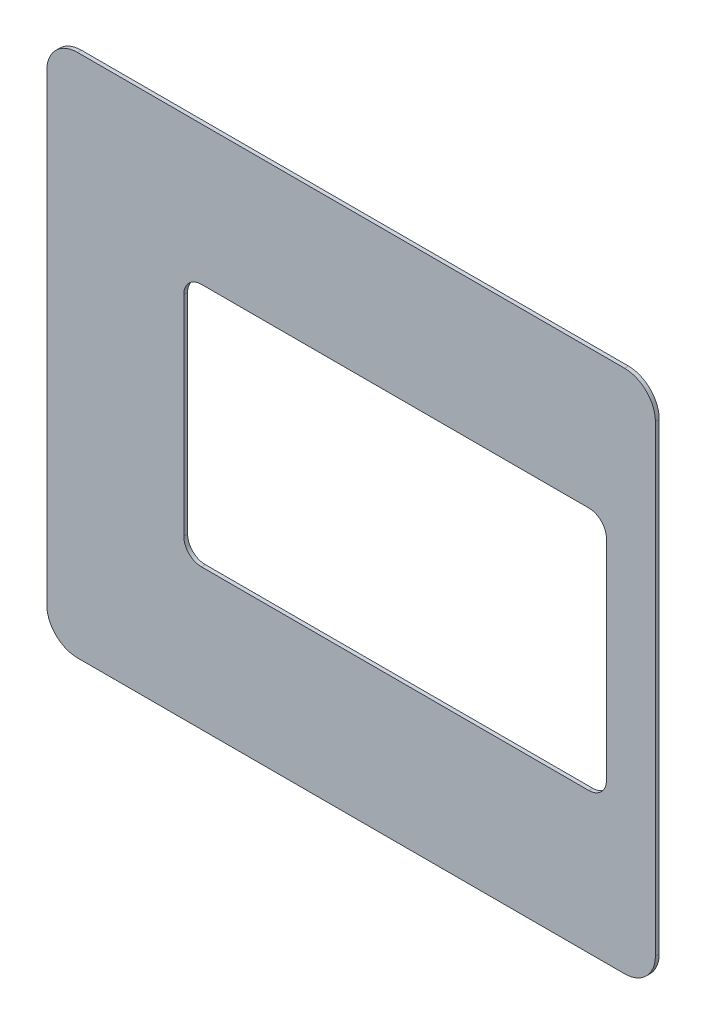
ISO-10303-21;
HEADER;
FILE_DESCRIPTION(('STEP AP214'),'2;1');
FILE_NAME('part.step','',(''),(''),'','','');
FILE_SCHEMA(('AUTOMOTIVE_DESIGN { 1 0 10303 214 1 1 1 1 }'));
ENDSEC;
DATA;
#1=APPLICATION_CONTEXT('core data for automotive mechanical design processes');
#2=APPLICATION_PROTOCOL_DEFINITION('international standard','automotive_design',2000,#1);
#3=PRODUCT_CONTEXT('',#1,'mechanical');
#4=PRODUCT('Part','Part','',(#3));
#5=PRODUCT_RELATED_PRODUCT_CATEGORY('part','',(#4));
#6=PRODUCT_DEFINITION_FORMATION('','',#4);
#7=PRODUCT_DEFINITION_CONTEXT('part definition',#1,'design');
#8=PRODUCT_DEFINITION('design','',#6,#7);
#9=PRODUCT_DEFINITION_SHAPE('','',#8);
#10=(LENGTH_UNIT() NAMED_UNIT(*) SI_UNIT(.MILLI.,.METRE.));
#11=(NAMED_UNIT(*) PLANE_ANGLE_UNIT() SI_UNIT($,.RADIAN.));
#12=(NAMED_UNIT(*) SI_UNIT($,.STERADIAN.) SOLID_ANGLE_UNIT());
#13=UNCERTAINTY_MEASURE_WITH_UNIT(LENGTH_MEASURE(1.E-05),#10,'distance_accuracy_value','');
#14=(GEOMETRIC_REPRESENTATION_CONTEXT(3) GLOBAL_UNCERTAINTY_ASSIGNED_CONTEXT((#13)) GLOBAL_UNIT_ASSIGNED_CONTEXT((#10,
#11,#12)) REPRESENTATION_CONTEXT('',''));
#15=CARTESIAN_POINT('',(0.,0.,0.));
#16=DIRECTION('',(0.,0.,1.));
#17=DIRECTION('',(1.,0.,0.));
#18=AXIS2_PLACEMENT_3D('',#15,#16,#17);
#19=CARTESIAN_POINT('',(-39.5,34.036,0.5));
#20=DIRECTION('',(1.,0.,0.));
#21=DIRECTION('',(0.,1.,0.));
#22=AXIS2_PLACEMENT_3D('',#19,#20,#21);
#23=PLANE('',#22);
#24=DIRECTION('',(0.,-1.,0.));
#25=VECTOR('',#24,1.);
#26=CARTESIAN_POINT('',(-39.5,34.036,0.));
#27=LINE('',#26,#25);
#28=CARTESIAN_POINT('',(-39.5,30.036,0.));
#29=VERTEX_POINT('',#28);
#30=CARTESIAN_POINT('',(-39.5,-30.036,0.));
#31=VERTEX_POINT('',#30);
#32=EDGE_CURVE('E232',#29,#31,#27,.T.);
#33=ORIENTED_EDGE('',*,*,#32,.T.);
#34=DIRECTION('',(0.,0.,-1.));
#35=VECTOR('',#34,1.);
#36=CARTESIAN_POINT('',(-39.5,-30.036,0.5));
#37=LINE('',#36,#35);
#38=CARTESIAN_POINT('',(-39.5,-30.036,0.5));
#39=VERTEX_POINT('',#38);
#40=EDGE_CURVE('E304',#31,#39,#37,.F.);
#41=ORIENTED_EDGE('',*,*,#40,.T.);
#42=DIRECTION('',(0.,-1.,0.));
#43=VECTOR('',#42,1.);
#44=CARTESIAN_POINT('',(-39.5,34.036,0.5));
#45=LINE('',#44,#43);
#46=CARTESIAN_POINT('',(-39.5,30.036,0.5));
#47=VERTEX_POINT('',#46);
#48=EDGE_CURVE('E250',#47,#39,#45,.T.);
#49=ORIENTED_EDGE('',*,*,#48,.F.);
#50=DIRECTION('',(0.,0.,-1.));
#51=VECTOR('',#50,1.);
#52=CARTESIAN_POINT('',(-39.5,30.036,0.5));
#53=LINE('',#52,#51);
#54=EDGE_CURVE('E300',#47,#29,#53,.T.);
#55=ORIENTED_EDGE('',*,*,#54,.T.);
#56=EDGE_LOOP('',(#33,#41,#49,#55));
#57=FACE_BOUND('',#56,.T.);
#58=ADVANCED_FACE('F42',(#57),#23,.F.);
#59=CARTESIAN_POINT('',(-39.5,-34.036,0.5));
#60=DIRECTION('',(0.,1.,0.));
#61=DIRECTION('',(0.,0.,1.));
#62=AXIS2_PLACEMENT_3D('',#59,#60,#61);
#63=PLANE('',#62);
#64=DIRECTION('',(1.,0.,0.));
#65=VECTOR('',#64,1.);
#66=CARTESIAN_POINT('',(-39.5,-34.036,0.5));
#67=LINE('',#66,#65);
#68=CARTESIAN_POINT('',(-35.5,-34.036,0.5));
#69=VERTEX_POINT('',#68);
#70=CARTESIAN_POINT('',(35.5,-34.036,0.5));
#71=VERTEX_POINT('',#70);
#72=EDGE_CURVE('E254',#69,#71,#67,.T.);
#73=ORIENTED_EDGE('',*,*,#72,.F.);
#74=DIRECTION('',(0.,0.,-1.));
#75=VECTOR('',#74,1.);
#76=CARTESIAN_POINT('',(-35.5,-34.036,0.5));
#77=LINE('',#76,#75);
#78=CARTESIAN_POINT('',(-35.5,-34.036,0.));
#79=VERTEX_POINT('',#78);
#80=EDGE_CURVE('E284',#69,#79,#77,.T.);
#81=ORIENTED_EDGE('',*,*,#80,.T.);
#82=DIRECTION('',(1.,0.,0.));
#83=VECTOR('',#82,1.);
#84=CARTESIAN_POINT('',(-39.5,-34.036,0.));
#85=LINE('',#84,#83);
#86=CARTESIAN_POINT('',(35.5,-34.036,0.));
#87=VERTEX_POINT('',#86);
#88=EDGE_CURVE('E271',#79,#87,#85,.T.);
#89=ORIENTED_EDGE('',*,*,#88,.T.);
#90=DIRECTION('',(0.,0.,-1.));
#91=VECTOR('',#90,1.);
#92=CARTESIAN_POINT('',(35.5,-34.036,0.5));
#93=LINE('',#92,#91);
#94=EDGE_CURVE('E267',#87,#71,#93,.F.);
#95=ORIENTED_EDGE('',*,*,#94,.T.);
#96=EDGE_LOOP('',(#73,#81,#89,#95));
#97=FACE_BOUND('',#96,.T.);
#98=ADVANCED_FACE('F350',(#97),#63,.F.);
#99=CARTESIAN_POINT('',(39.5,34.036,0.5));
#100=DIRECTION('',(-1.,0.,0.));
#101=DIRECTION('',(0.,-1.,0.));
#102=AXIS2_PLACEMENT_3D('',#99,#100,#101);
#103=PLANE('',#102);
#104=DIRECTION('',(0.,1.,0.));
#105=VECTOR('',#104,1.);
#106=CARTESIAN_POINT('',(39.5,34.036,0.5));
#107=LINE('',#106,#105);
#108=CARTESIAN_POINT('',(39.5,-30.036,0.5));
#109=VERTEX_POINT('',#108);
#110=CARTESIAN_POINT('',(39.5,30.036,0.5));
#111=VERTEX_POINT('',#110);
#112=EDGE_CURVE('E259',#109,#111,#107,.T.);
#113=ORIENTED_EDGE('',*,*,#112,.F.);
#114=DIRECTION('',(0.,0.,-1.));
#115=VECTOR('',#114,1.);
#116=CARTESIAN_POINT('',(39.5,-30.036,0.5));
#117=LINE('',#116,#115);
#118=CARTESIAN_POINT('',(39.5,-30.036,0.));
#119=VERTEX_POINT('',#118);
#120=EDGE_CURVE('E322',#109,#119,#117,.T.);
#121=ORIENTED_EDGE('',*,*,#120,.T.);
#122=DIRECTION('',(0.,1.,0.));
#123=VECTOR('',#122,1.);
#124=CARTESIAN_POINT('',(39.5,34.036,0.));
#125=LINE('',#124,#123);
#126=CARTESIAN_POINT('',(39.5,30.036,0.));
#127=VERTEX_POINT('',#126);
#128=EDGE_CURVE('E275',#119,#127,#125,.T.);
#129=ORIENTED_EDGE('',*,*,#128,.T.);
#130=DIRECTION('',(0.,0.,-1.));
#131=VECTOR('',#130,1.);
#132=CARTESIAN_POINT('',(39.5,30.036,0.5));
#133=LINE('',#132,#131);
#134=EDGE_CURVE('E319',#127,#111,#133,.F.);
#135=ORIENTED_EDGE('',*,*,#134,.T.);
#136=EDGE_LOOP('',(#113,#121,#129,#135));
#137=FACE_BOUND('',#136,.T.);
#138=ADVANCED_FACE('F359',(#137),#103,.F.);
#139=CARTESIAN_POINT('',(-39.5,34.036,0.5));
#140=DIRECTION('',(0.,-1.,0.));
#141=DIRECTION('',(0.,0.,-1.));
#142=AXIS2_PLACEMENT_3D('',#139,#140,#141);
#143=PLANE('',#142);
#144=DIRECTION('',(-1.,0.,0.));
#145=VECTOR('',#144,1.);
#146=CARTESIAN_POINT('',(-39.5,34.036,0.5));
#147=LINE('',#146,#145);
#148=CARTESIAN_POINT('',(35.5,34.036,0.5));
#149=VERTEX_POINT('',#148);
#150=CARTESIAN_POINT('',(-35.5,34.036,0.5));
#151=VERTEX_POINT('',#150);
#152=EDGE_CURVE('E263',#149,#151,#147,.T.);
#153=ORIENTED_EDGE('',*,*,#152,.F.);
#154=DIRECTION('',(0.,0.,-1.));
#155=VECTOR('',#154,1.);
#156=CARTESIAN_POINT('',(35.5,34.036,0.5));
#157=LINE('',#156,#155);
#158=CARTESIAN_POINT('',(35.5,34.036,0.));
#159=VERTEX_POINT('',#158);
#160=EDGE_CURVE('E11',#149,#159,#157,.T.);
#161=ORIENTED_EDGE('',*,*,#160,.T.);
#162=DIRECTION('',(-1.,0.,0.));
#163=VECTOR('',#162,1.);
#164=CARTESIAN_POINT('',(-39.5,34.036,0.));
#165=LINE('',#164,#163);
#166=CARTESIAN_POINT('',(-35.5,34.036,0.));
#167=VERTEX_POINT('',#166);
#168=EDGE_CURVE('E255',#159,#167,#165,.T.);
#169=ORIENTED_EDGE('',*,*,#168,.T.);
#170=DIRECTION('',(0.,0.,-1.));
#171=VECTOR('',#170,1.);
#172=CARTESIAN_POINT('',(-35.5,34.036,0.5));
#173=LINE('',#172,#171);
#174=EDGE_CURVE('E51',#167,#151,#173,.F.);
#175=ORIENTED_EDGE('',*,*,#174,.T.);
#176=EDGE_LOOP('',(#153,#161,#169,#175));
#177=FACE_BOUND('',#176,.T.);
#178=ADVANCED_FACE('F330',(#177),#143,.F.);
#179=CARTESIAN_POINT('',(-39.5,-34.036,0.5));
#180=DIRECTION('',(0.,0.,1.));
#181=DIRECTION('',(1.,0.,0.));
#182=AXIS2_PLACEMENT_3D('',#179,#180,#181);
#183=PLANE('',#182);
#184=CARTESIAN_POINT('',(30.864,13.716,0.5));
#185=DIRECTION('',(0.,0.,1.));
#186=DIRECTION('',(-1.,0.,0.));
#187=AXIS2_PLACEMENT_3D('',#184,#185,#186);
#188=CIRCLE('',#187,2.286);
#189=CARTESIAN_POINT('',(33.15,13.716,0.5));
#190=VERTEX_POINT('',#189);
#191=CARTESIAN_POINT('',(30.864,16.002,0.5));
#192=VERTEX_POINT('',#191);
#193=EDGE_CURVE('E58',#190,#192,#188,.T.);
#194=ORIENTED_EDGE('',*,*,#193,.F.);
#195=DIRECTION('',(0.,1.,0.));
#196=VECTOR('',#195,1.);
#197=CARTESIAN_POINT('',(33.15,13.716,0.5));
#198=LINE('',#197,#196);
#199=CARTESIAN_POINT('',(33.15,-13.462,0.5));
#200=VERTEX_POINT('',#199);
#201=EDGE_CURVE('E178',#200,#190,#198,.T.);
#202=ORIENTED_EDGE('',*,*,#201,.F.);
#203=CARTESIAN_POINT('',(30.864,-13.462,0.5));
#204=DIRECTION('',(0.,0.,1.));
#205=DIRECTION('',(-1.,0.,0.));
#206=AXIS2_PLACEMENT_3D('',#203,#204,#205);
#207=CIRCLE('',#206,2.286);
#208=CARTESIAN_POINT('',(30.864,-15.748,0.5));
#209=VERTEX_POINT('',#208);
#210=EDGE_CURVE('E183',#209,#200,#207,.T.);
#211=ORIENTED_EDGE('',*,*,#210,.F.);
#212=DIRECTION('',(1.,0.,0.));
#213=VECTOR('',#212,1.);
#214=CARTESIAN_POINT('',(-19.428,-15.748,0.5));
#215=LINE('',#214,#213);
#216=CARTESIAN_POINT('',(-19.428,-15.748,0.5));
#217=VERTEX_POINT('',#216);
#218=EDGE_CURVE('E222',#217,#209,#215,.T.);
#219=ORIENTED_EDGE('',*,*,#218,.F.);
#220=CARTESIAN_POINT('',(-19.428,-13.462,0.5));
#221=DIRECTION('',(0.,0.,1.));
#222=DIRECTION('',(1.,0.,0.));
#223=AXIS2_PLACEMENT_3D('',#220,#221,#222);
#224=CIRCLE('',#223,2.286);
#225=CARTESIAN_POINT('',(-21.714,-13.462,0.5));
#226=VERTEX_POINT('',#225);
#227=EDGE_CURVE('E218',#226,#217,#224,.T.);
#228=ORIENTED_EDGE('',*,*,#227,.F.);
#229=DIRECTION('',(0.,-1.,0.));
#230=VECTOR('',#229,1.);
#231=CARTESIAN_POINT('',(-21.714,13.716,0.5));
#232=LINE('',#231,#230);
#233=CARTESIAN_POINT('',(-21.714,13.716,0.5));
#234=VERTEX_POINT('',#233);
#235=EDGE_CURVE('E214',#234,#226,#232,.T.);
#236=ORIENTED_EDGE('',*,*,#235,.F.);
#237=CARTESIAN_POINT('',(-19.428,13.716,0.5));
#238=DIRECTION('',(0.,0.,1.));
#239=DIRECTION('',(1.,0.,0.));
#240=AXIS2_PLACEMENT_3D('',#237,#238,#239);
#241=CIRCLE('',#240,2.286);
#242=CARTESIAN_POINT('',(-19.428,16.002,0.5));
#243=VERTEX_POINT('',#242);
#244=EDGE_CURVE('E210',#243,#234,#241,.T.);
#245=ORIENTED_EDGE('',*,*,#244,.F.);
#246=DIRECTION('',(-1.,0.,0.));
#247=VECTOR('',#246,1.);
#248=CARTESIAN_POINT('',(-19.428,16.002,0.5));
#249=LINE('',#248,#247);
#250=EDGE_CURVE('E207',#192,#243,#249,.T.);
#251=ORIENTED_EDGE('',*,*,#250,.F.);
#252=EDGE_LOOP('',(#194,#202,#211,#219,#228,#236,#245,#251));
#253=FACE_BOUND('',#252,.T.);
#254=ORIENTED_EDGE('',*,*,#48,.T.);
#255=CARTESIAN_POINT('',(-35.5,-30.036,0.5));
#256=DIRECTION('',(0.,0.,1.));
#257=DIRECTION('',(1.,0.,0.));
#258=AXIS2_PLACEMENT_3D('',#255,#256,#257);
#259=CIRCLE('',#258,4.);
#260=EDGE_CURVE('E316',#39,#69,#259,.T.);
#261=ORIENTED_EDGE('',*,*,#260,.T.);
#262=ORIENTED_EDGE('',*,*,#72,.T.);
#263=CARTESIAN_POINT('',(35.5,-30.036,0.5));
#264=DIRECTION('',(0.,0.,1.));
#265=DIRECTION('',(1.,0.,0.));
#266=AXIS2_PLACEMENT_3D('',#263,#264,#265);
#267=CIRCLE('',#266,4.);
#268=EDGE_CURVE('E313',#71,#109,#267,.T.);
#269=ORIENTED_EDGE('',*,*,#268,.T.);
#270=ORIENTED_EDGE('',*,*,#112,.T.);
#271=CARTESIAN_POINT('',(35.5,30.036,0.5));
#272=DIRECTION('',(0.,0.,1.));
#273=DIRECTION('',(1.,0.,0.));
#274=AXIS2_PLACEMENT_3D('',#271,#272,#273);
#275=CIRCLE('',#274,4.);
#276=EDGE_CURVE('E310',#111,#149,#275,.T.);
#277=ORIENTED_EDGE('',*,*,#276,.T.);
#278=ORIENTED_EDGE('',*,*,#152,.T.);
#279=CARTESIAN_POINT('',(-35.5,30.036,0.5));
#280=DIRECTION('',(0.,0.,1.));
#281=DIRECTION('',(1.,0.,0.));
#282=AXIS2_PLACEMENT_3D('',#279,#280,#281);
#283=CIRCLE('',#282,4.);
#284=EDGE_CURVE('E307',#151,#47,#283,.T.);
#285=ORIENTED_EDGE('',*,*,#284,.T.);
#286=EDGE_LOOP('',(#254,#261,#262,#269,#270,#277,#278,#285));
#287=FACE_BOUND('',#286,.T.);
#288=ADVANCED_FACE('F336',(#253,#287),#183,.T.);
#289=CARTESIAN_POINT('',(-39.5,-34.036,0.));
#290=DIRECTION('',(0.,0.,1.));
#291=DIRECTION('',(1.,0.,0.));
#292=AXIS2_PLACEMENT_3D('',#289,#290,#291);
#293=PLANE('',#292);
#294=DIRECTION('',(0.,1.,0.));
#295=VECTOR('',#294,1.);
#296=CARTESIAN_POINT('',(33.15,13.716,0.));
#297=LINE('',#296,#295);
#298=CARTESIAN_POINT('',(33.15,-13.462,0.));
#299=VERTEX_POINT('',#298);
#300=CARTESIAN_POINT('',(33.15,13.716,0.));
#301=VERTEX_POINT('',#300);
#302=EDGE_CURVE('E165',#299,#301,#297,.T.);
#303=ORIENTED_EDGE('',*,*,#302,.T.);
#304=CARTESIAN_POINT('',(30.864,13.716,0.));
#305=DIRECTION('',(0.,0.,1.));
#306=DIRECTION('',(-1.,0.,0.));
#307=AXIS2_PLACEMENT_3D('',#304,#305,#306);
#308=CIRCLE('',#307,2.286);
#309=CARTESIAN_POINT('',(30.864,16.002,0.));
#310=VERTEX_POINT('',#309);
#311=EDGE_CURVE('E158',#301,#310,#308,.T.);
#312=ORIENTED_EDGE('',*,*,#311,.T.);
#313=DIRECTION('',(-1.,0.,0.));
#314=VECTOR('',#313,1.);
#315=CARTESIAN_POINT('',(-19.428,16.002,0.));
#316=LINE('',#315,#314);
#317=CARTESIAN_POINT('',(-19.428,16.002,0.));
#318=VERTEX_POINT('',#317);
#319=EDGE_CURVE('E168',#310,#318,#316,.T.);
#320=ORIENTED_EDGE('',*,*,#319,.T.);
#321=CARTESIAN_POINT('',(-19.428,13.716,0.));
#322=DIRECTION('',(0.,0.,1.));
#323=DIRECTION('',(1.,0.,0.));
#324=AXIS2_PLACEMENT_3D('',#321,#322,#323);
#325=CIRCLE('',#324,2.286);
#326=CARTESIAN_POINT('',(-21.714,13.716,0.));
#327=VERTEX_POINT('',#326);
#328=EDGE_CURVE('E66',#318,#327,#325,.T.);
#329=ORIENTED_EDGE('',*,*,#328,.T.);
#330=DIRECTION('',(0.,-1.,0.));
#331=VECTOR('',#330,1.);
#332=CARTESIAN_POINT('',(-21.714,13.716,0.));
#333=LINE('',#332,#331);
#334=CARTESIAN_POINT('',(-21.714,-13.462,0.));
#335=VERTEX_POINT('',#334);
#336=EDGE_CURVE('E188',#327,#335,#333,.T.);
#337=ORIENTED_EDGE('',*,*,#336,.T.);
#338=CARTESIAN_POINT('',(-19.428,-13.462,0.));
#339=DIRECTION('',(0.,0.,1.));
#340=DIRECTION('',(1.,0.,0.));
#341=AXIS2_PLACEMENT_3D('',#338,#339,#340);
#342=CIRCLE('',#341,2.286);
#343=CARTESIAN_POINT('',(-19.428,-15.748,0.));
#344=VERTEX_POINT('',#343);
#345=EDGE_CURVE('E192',#335,#344,#342,.T.);
#346=ORIENTED_EDGE('',*,*,#345,.T.);
#347=DIRECTION('',(1.,0.,0.));
#348=VECTOR('',#347,1.);
#349=CARTESIAN_POINT('',(-19.428,-15.748,0.));
#350=LINE('',#349,#348);
#351=CARTESIAN_POINT('',(30.864,-15.748,0.));
#352=VERTEX_POINT('',#351);
#353=EDGE_CURVE('E196',#344,#352,#350,.T.);
#354=ORIENTED_EDGE('',*,*,#353,.T.);
#355=CARTESIAN_POINT('',(30.864,-13.462,0.));
#356=DIRECTION('',(0.,0.,1.));
#357=DIRECTION('',(-1.,0.,0.));
#358=AXIS2_PLACEMENT_3D('',#355,#356,#357);
#359=CIRCLE('',#358,2.286);
#360=EDGE_CURVE('E200',#352,#299,#359,.T.);
#361=ORIENTED_EDGE('',*,*,#360,.T.);
#362=EDGE_LOOP('',(#303,#312,#320,#329,#337,#346,#354,#361));
#363=FACE_BOUND('',#362,.T.);
#364=ORIENTED_EDGE('',*,*,#88,.F.);
#365=CARTESIAN_POINT('',(-35.5,-30.036,0.));
#366=DIRECTION('',(0.,0.,1.));
#367=DIRECTION('',(1.,0.,0.));
#368=AXIS2_PLACEMENT_3D('',#365,#366,#367);
#369=CIRCLE('',#368,4.);
#370=EDGE_CURVE('E297',#79,#31,#369,.F.);
#371=ORIENTED_EDGE('',*,*,#370,.T.);
#372=ORIENTED_EDGE('',*,*,#32,.F.);
#373=CARTESIAN_POINT('',(-35.5,30.036,0.));
#374=DIRECTION('',(0.,0.,1.));
#375=DIRECTION('',(1.,0.,0.));
#376=AXIS2_PLACEMENT_3D('',#373,#374,#375);
#377=CIRCLE('',#376,4.);
#378=EDGE_CURVE('E288',#29,#167,#377,.F.);
#379=ORIENTED_EDGE('',*,*,#378,.T.);
#380=ORIENTED_EDGE('',*,*,#168,.F.);
#381=CARTESIAN_POINT('',(35.5,30.036,0.));
#382=DIRECTION('',(0.,0.,1.));
#383=DIRECTION('',(1.,0.,0.));
#384=AXIS2_PLACEMENT_3D('',#381,#382,#383);
#385=CIRCLE('',#384,4.);
#386=EDGE_CURVE('E291',#159,#127,#385,.F.);
#387=ORIENTED_EDGE('',*,*,#386,.T.);
#388=ORIENTED_EDGE('',*,*,#128,.F.);
#389=CARTESIAN_POINT('',(35.5,-30.036,0.));
#390=DIRECTION('',(0.,0.,1.));
#391=DIRECTION('',(1.,0.,0.));
#392=AXIS2_PLACEMENT_3D('',#389,#390,#391);
#393=CIRCLE('',#392,4.);
#394=EDGE_CURVE('E294',#119,#87,#393,.F.);
#395=ORIENTED_EDGE('',*,*,#394,.T.);
#396=EDGE_LOOP('',(#364,#371,#372,#379,#380,#387,#388,#395));
#397=FACE_BOUND('',#396,.T.);
#398=ADVANCED_FACE('F173',(#363,#397),#293,.F.);
#399=CARTESIAN_POINT('',(-35.5,-30.036,0.5));
#400=DIRECTION('',(0.,0.,-1.));
#401=DIRECTION('',(-1.,0.,0.));
#402=AXIS2_PLACEMENT_3D('',#399,#400,#401);
#403=CYLINDRICAL_SURFACE('',#402,4.);
#404=ORIENTED_EDGE('',*,*,#260,.F.);
#405=ORIENTED_EDGE('',*,*,#40,.F.);
#406=ORIENTED_EDGE('',*,*,#370,.F.);
#407=ORIENTED_EDGE('',*,*,#80,.F.);
#408=EDGE_LOOP('',(#404,#405,#406,#407));
#409=FACE_BOUND('',#408,.T.);
#410=ADVANCED_FACE('F347',(#409),#403,.T.);
#411=CARTESIAN_POINT('',(35.5,-30.036,0.5));
#412=DIRECTION('',(0.,0.,-1.));
#413=DIRECTION('',(-1.,0.,0.));
#414=AXIS2_PLACEMENT_3D('',#411,#412,#413);
#415=CYLINDRICAL_SURFACE('',#414,4.);
#416=ORIENTED_EDGE('',*,*,#268,.F.);
#417=ORIENTED_EDGE('',*,*,#94,.F.);
#418=ORIENTED_EDGE('',*,*,#394,.F.);
#419=ORIENTED_EDGE('',*,*,#120,.F.);
#420=EDGE_LOOP('',(#416,#417,#418,#419));
#421=FACE_BOUND('',#420,.T.);
#422=ADVANCED_FACE('F356',(#421),#415,.T.);
#423=CARTESIAN_POINT('',(35.5,30.036,0.5));
#424=DIRECTION('',(0.,0.,-1.));
#425=DIRECTION('',(-1.,0.,0.));
#426=AXIS2_PLACEMENT_3D('',#423,#424,#425);
#427=CYLINDRICAL_SURFACE('',#426,4.);
#428=ORIENTED_EDGE('',*,*,#276,.F.);
#429=ORIENTED_EDGE('',*,*,#134,.F.);
#430=ORIENTED_EDGE('',*,*,#386,.F.);
#431=ORIENTED_EDGE('',*,*,#160,.F.);
#432=EDGE_LOOP('',(#428,#429,#430,#431));
#433=FACE_BOUND('',#432,.T.);
#434=ADVANCED_FACE('F362',(#433),#427,.T.);
#435=CARTESIAN_POINT('',(-35.5,30.036,0.5));
#436=DIRECTION('',(0.,0.,-1.));
#437=DIRECTION('',(-1.,0.,0.));
#438=AXIS2_PLACEMENT_3D('',#435,#436,#437);
#439=CYLINDRICAL_SURFACE('',#438,4.);
#440=ORIENTED_EDGE('',*,*,#284,.F.);
#441=ORIENTED_EDGE('',*,*,#174,.F.);
#442=ORIENTED_EDGE('',*,*,#378,.F.);
#443=ORIENTED_EDGE('',*,*,#54,.F.);
#444=EDGE_LOOP('',(#440,#441,#442,#443));
#445=FACE_BOUND('',#444,.T.);
#446=ADVANCED_FACE('F44',(#445),#439,.T.);
#447=CARTESIAN_POINT('',(30.864,13.716,0.));
#448=DIRECTION('',(0.,0.,1.));
#449=DIRECTION('',(1.,0.,0.));
#450=AXIS2_PLACEMENT_3D('',#447,#448,#449);
#451=CYLINDRICAL_SURFACE('',#450,2.286);
#452=ORIENTED_EDGE('',*,*,#193,.T.);
#453=DIRECTION('',(0.,0.,1.));
#454=VECTOR('',#453,1.);
#455=CARTESIAN_POINT('',(30.864,16.002,0.));
#456=LINE('',#455,#454);
#457=EDGE_CURVE('E154',#310,#192,#456,.T.);
#458=ORIENTED_EDGE('',*,*,#457,.F.);
#459=ORIENTED_EDGE('',*,*,#311,.F.);
#460=DIRECTION('',(0.,0.,1.));
#461=VECTOR('',#460,1.);
#462=CARTESIAN_POINT('',(33.15,13.716,0.));
#463=LINE('',#462,#461);
#464=EDGE_CURVE('E229',#301,#190,#463,.T.);
#465=ORIENTED_EDGE('',*,*,#464,.T.);
#466=EDGE_LOOP('',(#452,#458,#459,#465));
#467=FACE_BOUND('',#466,.T.);
#468=ADVANCED_FACE('F156',(#467),#451,.F.);
#469=CARTESIAN_POINT('',(33.15,13.716,0.));
#470=DIRECTION('',(1.,0.,0.));
#471=DIRECTION('',(0.,1.,0.));
#472=AXIS2_PLACEMENT_3D('',#469,#470,#471);
#473=PLANE('',#472);
#474=ORIENTED_EDGE('',*,*,#201,.T.);
#475=ORIENTED_EDGE('',*,*,#464,.F.);
#476=ORIENTED_EDGE('',*,*,#302,.F.);
#477=DIRECTION('',(0.,0.,1.));
#478=VECTOR('',#477,1.);
#479=CARTESIAN_POINT('',(33.15,-13.462,0.));
#480=LINE('',#479,#478);
#481=EDGE_CURVE('E233',#299,#200,#480,.T.);
#482=ORIENTED_EDGE('',*,*,#481,.T.);
#483=EDGE_LOOP('',(#474,#475,#476,#482));
#484=FACE_BOUND('',#483,.T.);
#485=ADVANCED_FACE('F436',(#484),#473,.F.);
#486=CARTESIAN_POINT('',(30.864,-13.462,0.));
#487=DIRECTION('',(0.,0.,1.));
#488=DIRECTION('',(1.,0.,0.));
#489=AXIS2_PLACEMENT_3D('',#486,#487,#488);
#490=CYLINDRICAL_SURFACE('',#489,2.286);
#491=ORIENTED_EDGE('',*,*,#210,.T.);
#492=ORIENTED_EDGE('',*,*,#481,.F.);
#493=ORIENTED_EDGE('',*,*,#360,.F.);
#494=DIRECTION('',(0.,0.,1.));
#495=VECTOR('',#494,1.);
#496=CARTESIAN_POINT('',(30.864,-15.748,0.));
#497=LINE('',#496,#495);
#498=EDGE_CURVE('E236',#352,#209,#497,.T.);
#499=ORIENTED_EDGE('',*,*,#498,.T.);
#500=EDGE_LOOP('',(#491,#492,#493,#499));
#501=FACE_BOUND('',#500,.T.);
#502=ADVANCED_FACE('F444',(#501),#490,.F.);
#503=CARTESIAN_POINT('',(-19.428,-15.748,0.));
#504=DIRECTION('',(0.,-1.,0.));
#505=DIRECTION('',(0.,0.,-1.));
#506=AXIS2_PLACEMENT_3D('',#503,#504,#505);
#507=PLANE('',#506);
#508=ORIENTED_EDGE('',*,*,#218,.T.);
#509=ORIENTED_EDGE('',*,*,#498,.F.);
#510=ORIENTED_EDGE('',*,*,#353,.F.);
#511=DIRECTION('',(0.,0.,1.));
#512=VECTOR('',#511,1.);
#513=CARTESIAN_POINT('',(-19.428,-15.748,0.));
#514=LINE('',#513,#512);
#515=EDGE_CURVE('E239',#344,#217,#514,.T.);
#516=ORIENTED_EDGE('',*,*,#515,.T.);
#517=EDGE_LOOP('',(#508,#509,#510,#516));
#518=FACE_BOUND('',#517,.T.);
#519=ADVANCED_FACE('F454',(#518),#507,.F.);
#520=CARTESIAN_POINT('',(-19.428,-13.462,0.));
#521=DIRECTION('',(0.,0.,1.));
#522=DIRECTION('',(1.,0.,0.));
#523=AXIS2_PLACEMENT_3D('',#520,#521,#522);
#524=CYLINDRICAL_SURFACE('',#523,2.286);
#525=ORIENTED_EDGE('',*,*,#227,.T.);
#526=ORIENTED_EDGE('',*,*,#515,.F.);
#527=ORIENTED_EDGE('',*,*,#345,.F.);
#528=DIRECTION('',(0.,0.,1.));
#529=VECTOR('',#528,1.);
#530=CARTESIAN_POINT('',(-21.714,-13.462,0.));
#531=LINE('',#530,#529);
#532=EDGE_CURVE('E242',#335,#226,#531,.T.);
#533=ORIENTED_EDGE('',*,*,#532,.T.);
#534=EDGE_LOOP('',(#525,#526,#527,#533));
#535=FACE_BOUND('',#534,.T.);
#536=ADVANCED_FACE('F464',(#535),#524,.F.);
#537=CARTESIAN_POINT('',(-21.714,13.716,0.));
#538=DIRECTION('',(-1.,0.,0.));
#539=DIRECTION('',(0.,-1.,0.));
#540=AXIS2_PLACEMENT_3D('',#537,#538,#539);
#541=PLANE('',#540);
#542=ORIENTED_EDGE('',*,*,#235,.T.);
#543=ORIENTED_EDGE('',*,*,#532,.F.);
#544=ORIENTED_EDGE('',*,*,#336,.F.);
#545=DIRECTION('',(0.,0.,1.));
#546=VECTOR('',#545,1.);
#547=CARTESIAN_POINT('',(-21.714,13.716,0.));
#548=LINE('',#547,#546);
#549=EDGE_CURVE('E245',#327,#234,#548,.T.);
#550=ORIENTED_EDGE('',*,*,#549,.T.);
#551=EDGE_LOOP('',(#542,#543,#544,#550));
#552=FACE_BOUND('',#551,.T.);
#553=ADVANCED_FACE('F474',(#552),#541,.F.);
#554=CARTESIAN_POINT('',(-19.428,13.716,0.));
#555=DIRECTION('',(0.,0.,1.));
#556=DIRECTION('',(1.,0.,0.));
#557=AXIS2_PLACEMENT_3D('',#554,#555,#556);
#558=CYLINDRICAL_SURFACE('',#557,2.286);
#559=ORIENTED_EDGE('',*,*,#244,.T.);
#560=ORIENTED_EDGE('',*,*,#549,.F.);
#561=ORIENTED_EDGE('',*,*,#328,.F.);
#562=DIRECTION('',(0.,0.,1.));
#563=VECTOR('',#562,1.);
#564=CARTESIAN_POINT('',(-19.428,16.002,0.));
#565=LINE('',#564,#563);
#566=EDGE_CURVE('E164',#318,#243,#565,.T.);
#567=ORIENTED_EDGE('',*,*,#566,.T.);
#568=EDGE_LOOP('',(#559,#560,#561,#567));
#569=FACE_BOUND('',#568,.T.);
#570=ADVANCED_FACE('F484',(#569),#558,.F.);
#571=CARTESIAN_POINT('',(-19.428,16.002,0.));
#572=DIRECTION('',(0.,1.,0.));
#573=DIRECTION('',(-1.,0.,0.));
#574=AXIS2_PLACEMENT_3D('',#571,#572,#573);
#575=PLANE('',#574);
#576=ORIENTED_EDGE('',*,*,#250,.T.);
#577=ORIENTED_EDGE('',*,*,#566,.F.);
#578=ORIENTED_EDGE('',*,*,#319,.F.);
#579=ORIENTED_EDGE('',*,*,#457,.T.);
#580=EDGE_LOOP('',(#576,#577,#578,#579));
#581=FACE_BOUND('',#580,.T.);
#582=ADVANCED_FACE('F169',(#581),#575,.F.);
#583=CLOSED_SHELL('',(#58,#98,#138,#178,#288,#398,#410,#422,#434,#446,#468,#485,#502,#519,#536,
#553,#570,#582));
#584=MANIFOLD_SOLID_BREP('B2',#583);
#585=ADVANCED_BREP_SHAPE_REPRESENTATION('',(#18,#584),#14);
#586=SHAPE_DEFINITION_REPRESENTATION(#9,#585);
ENDSEC;
END-ISO-10303-21;
